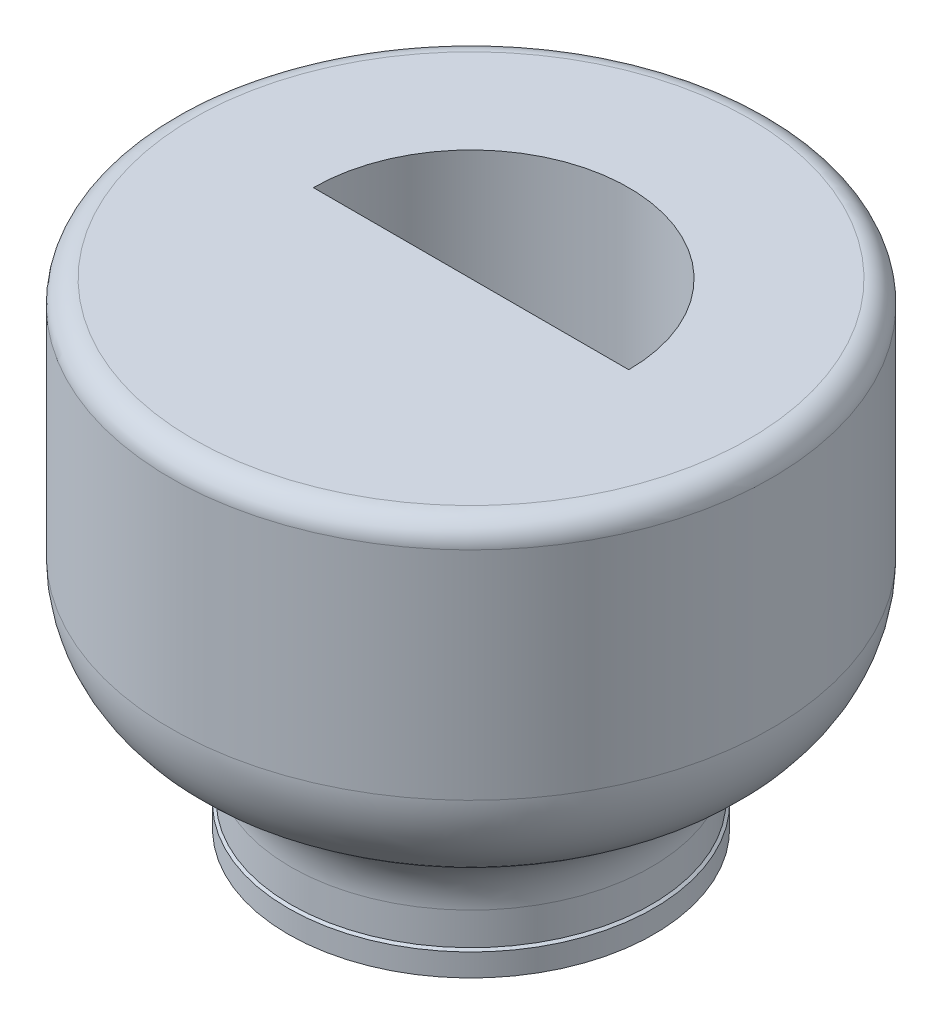
ISO-10303-21;
HEADER;
FILE_DESCRIPTION(('STEP AP214'),'2;1');
FILE_NAME('part.step','',(''),(''),'','','');
FILE_SCHEMA(('AUTOMOTIVE_DESIGN { 1 0 10303 214 1 1 1 1 }'));
ENDSEC;
DATA;
#1=APPLICATION_CONTEXT('core data for automotive mechanical design processes');
#2=APPLICATION_PROTOCOL_DEFINITION('international standard','automotive_design',2000,#1);
#3=PRODUCT_CONTEXT('',#1,'mechanical');
#4=PRODUCT('Part','Part','',(#3));
#5=PRODUCT_RELATED_PRODUCT_CATEGORY('part','',(#4));
#6=PRODUCT_DEFINITION_FORMATION('','',#4);
#7=PRODUCT_DEFINITION_CONTEXT('part definition',#1,'design');
#8=PRODUCT_DEFINITION('design','',#6,#7);
#9=PRODUCT_DEFINITION_SHAPE('','',#8);
#10=(LENGTH_UNIT() NAMED_UNIT(*) SI_UNIT(.MILLI.,.METRE.));
#11=(NAMED_UNIT(*) PLANE_ANGLE_UNIT() SI_UNIT($,.RADIAN.));
#12=(NAMED_UNIT(*) SI_UNIT($,.STERADIAN.) SOLID_ANGLE_UNIT());
#13=UNCERTAINTY_MEASURE_WITH_UNIT(LENGTH_MEASURE(1.E-05),#10,'distance_accuracy_value','');
#14=(GEOMETRIC_REPRESENTATION_CONTEXT(3) GLOBAL_UNCERTAINTY_ASSIGNED_CONTEXT((#13)) GLOBAL_UNIT_ASSIGNED_CONTEXT((#10,
#11,#12)) REPRESENTATION_CONTEXT('',''));
#15=CARTESIAN_POINT('',(0.,0.,0.));
#16=DIRECTION('',(0.,0.,1.));
#17=DIRECTION('',(1.,0.,0.));
#18=AXIS2_PLACEMENT_3D('',#15,#16,#17);
#19=CARTESIAN_POINT('',(0.,0.,0.));
#20=DIRECTION('',(0.,-1.,0.));
#21=DIRECTION('',(0.,0.,-1.));
#22=AXIS2_PLACEMENT_3D('',#19,#20,#21);
#23=CYLINDRICAL_SURFACE('',#22,22.5);
#24=CARTESIAN_POINT('',(0.,0.,0.));
#25=DIRECTION('',(0.,-1.,0.));
#26=DIRECTION('',(0.,0.,-1.));
#27=AXIS2_PLACEMENT_3D('',#24,#25,#26);
#28=CIRCLE('',#27,22.5);
#29=CARTESIAN_POINT('',(0.,0.,-22.5));
#30=VERTEX_POINT('',#29);
#31=EDGE_CURVE('E130',#30,#30,#28,.T.);
#32=ORIENTED_EDGE('',*,*,#31,.T.);
#33=EDGE_LOOP('',(#32));
#34=FACE_BOUND('',#33,.T.);
#35=CARTESIAN_POINT('',(0.,12.5,0.));
#36=DIRECTION('',(0.,-1.,0.));
#37=DIRECTION('',(0.,0.,-1.));
#38=AXIS2_PLACEMENT_3D('',#35,#36,#37);
#39=CIRCLE('',#38,22.5);
#40=CARTESIAN_POINT('',(0.,12.5,-22.5));
#41=VERTEX_POINT('',#40);
#42=EDGE_CURVE('E176',#41,#41,#39,.T.);
#43=ORIENTED_EDGE('',*,*,#42,.F.);
#44=EDGE_LOOP('',(#43));
#45=FACE_BOUND('',#44,.T.);
#46=ADVANCED_FACE('F42',(#34,#45),#23,.F.);
#47=CARTESIAN_POINT('',(0.,12.5,0.));
#48=DIRECTION('',(0.,-1.,0.));
#49=DIRECTION('',(0.,0.,-1.));
#50=AXIS2_PLACEMENT_3D('',#47,#48,#49);
#51=TOROIDAL_SURFACE('',#50,22.,0.5);
#52=ORIENTED_EDGE('',*,*,#42,.T.);
#53=EDGE_LOOP('',(#52));
#54=FACE_BOUND('',#53,.T.);
#55=CARTESIAN_POINT('',(0.,13.,0.));
#56=DIRECTION('',(0.,-1.,0.));
#57=DIRECTION('',(0.,0.,-1.));
#58=AXIS2_PLACEMENT_3D('',#55,#56,#57);
#59=CIRCLE('',#58,22.);
#60=CARTESIAN_POINT('',(0.,13.,-22.));
#61=VERTEX_POINT('',#60);
#62=EDGE_CURVE('E172',#61,#61,#59,.T.);
#63=ORIENTED_EDGE('',*,*,#62,.F.);
#64=EDGE_LOOP('',(#63));
#65=FACE_BOUND('',#64,.T.);
#66=ADVANCED_FACE('F249',(#54,#65),#51,.F.);
#67=CARTESIAN_POINT('',(0.,13.,0.));
#68=DIRECTION('',(0.,-1.,0.));
#69=DIRECTION('',(0.,0.,-1.));
#70=AXIS2_PLACEMENT_3D('',#67,#68,#69);
#71=PLANE('',#70);
#72=CARTESIAN_POINT('',(0.,13.,0.));
#73=DIRECTION('',(0.,-1.,0.));
#74=DIRECTION('',(0.,0.,1.));
#75=AXIS2_PLACEMENT_3D('',#72,#73,#74);
#76=CIRCLE('',#75,21.);
#77=CARTESIAN_POINT('',(-21.,13.,0.));
#78=VERTEX_POINT('',#77);
#79=CARTESIAN_POINT('',(21.,13.,0.));
#80=VERTEX_POINT('',#79);
#81=EDGE_CURVE('E57',#78,#80,#76,.T.);
#82=ORIENTED_EDGE('',*,*,#81,.F.);
#83=DIRECTION('',(-1.,0.,0.));
#84=VECTOR('',#83,1.);
#85=CARTESIAN_POINT('',(21.,13.,0.));
#86=LINE('',#85,#84);
#87=EDGE_CURVE('E124',#80,#78,#86,.T.);
#88=ORIENTED_EDGE('',*,*,#87,.F.);
#89=EDGE_LOOP('',(#82,#88));
#90=FACE_BOUND('',#89,.T.);
#91=ORIENTED_EDGE('',*,*,#62,.T.);
#92=EDGE_LOOP('',(#91));
#93=FACE_BOUND('',#92,.T.);
#94=ADVANCED_FACE('F190',(#90,#93),#71,.T.);
#95=CARTESIAN_POINT('',(0.,63.4278760968653,0.));
#96=DIRECTION('',(0.,1.,0.));
#97=DIRECTION('',(0.,0.,1.));
#98=AXIS2_PLACEMENT_3D('',#95,#96,#97);
#99=PLANE('',#98);
#100=CARTESIAN_POINT('',(0.,63.4278760968653,0.));
#101=DIRECTION('',(0.,1.,0.));
#102=DIRECTION('',(0.,0.,1.));
#103=AXIS2_PLACEMENT_3D('',#100,#101,#102);
#104=CIRCLE('',#103,21.);
#105=CARTESIAN_POINT('',(21.,63.4278760968653,0.));
#106=VERTEX_POINT('',#105);
#107=CARTESIAN_POINT('',(-21.,63.4278760968653,0.));
#108=VERTEX_POINT('',#107);
#109=EDGE_CURVE('E11',#106,#108,#104,.T.);
#110=ORIENTED_EDGE('',*,*,#109,.F.);
#111=DIRECTION('',(1.,0.,0.));
#112=VECTOR('',#111,1.);
#113=CARTESIAN_POINT('',(0.,63.4278760968653,0.));
#114=LINE('',#113,#112);
#115=EDGE_CURVE('E50',#108,#106,#114,.T.);
#116=ORIENTED_EDGE('',*,*,#115,.F.);
#117=EDGE_LOOP('',(#110,#116));
#118=FACE_BOUND('',#117,.T.);
#119=CARTESIAN_POINT('',(0.,63.4278760968653,0.));
#120=DIRECTION('',(0.,-1.,0.));
#121=DIRECTION('',(0.,0.,-1.));
#122=AXIS2_PLACEMENT_3D('',#119,#120,#121);
#123=CIRCLE('',#122,37.);
#124=CARTESIAN_POINT('',(0.,63.4278760968653,-37.));
#125=VERTEX_POINT('',#124);
#126=EDGE_CURVE('E168',#125,#125,#123,.T.);
#127=ORIENTED_EDGE('',*,*,#126,.F.);
#128=EDGE_LOOP('',(#127));
#129=FACE_BOUND('',#128,.T.);
#130=ADVANCED_FACE('F186',(#118,#129),#99,.T.);
#131=CARTESIAN_POINT('',(0.,60.4278760968653,0.));
#132=DIRECTION('',(0.,-1.,0.));
#133=DIRECTION('',(0.,0.,-1.));
#134=AXIS2_PLACEMENT_3D('',#131,#132,#133);
#135=TOROIDAL_SURFACE('',#134,37.,3.);
#136=ORIENTED_EDGE('',*,*,#126,.T.);
#137=EDGE_LOOP('',(#136));
#138=FACE_BOUND('',#137,.T.);
#139=CARTESIAN_POINT('',(0.,60.4278760968653,0.));
#140=DIRECTION('',(0.,-1.,0.));
#141=DIRECTION('',(0.,0.,-1.));
#142=AXIS2_PLACEMENT_3D('',#139,#140,#141);
#143=CIRCLE('',#142,40.);
#144=CARTESIAN_POINT('',(0.,60.4278760968653,-40.));
#145=VERTEX_POINT('',#144);
#146=EDGE_CURVE('E164',#145,#145,#143,.T.);
#147=ORIENTED_EDGE('',*,*,#146,.F.);
#148=EDGE_LOOP('',(#147));
#149=FACE_BOUND('',#148,.T.);
#150=ADVANCED_FACE('F189',(#138,#149),#135,.T.);
#151=CARTESIAN_POINT('',(0.,0.,0.));
#152=DIRECTION('',(0.,-1.,0.));
#153=DIRECTION('',(0.,0.,-1.));
#154=AXIS2_PLACEMENT_3D('',#151,#152,#153);
#155=CYLINDRICAL_SURFACE('',#154,40.);
#156=ORIENTED_EDGE('',*,*,#146,.T.);
#157=EDGE_LOOP('',(#156));
#158=FACE_BOUND('',#157,.T.);
#159=CARTESIAN_POINT('',(0.,31.5562889655761,0.));
#160=DIRECTION('',(0.,-1.,0.));
#161=DIRECTION('',(0.,0.,-1.));
#162=AXIS2_PLACEMENT_3D('',#159,#160,#161);
#163=CIRCLE('',#162,40.);
#164=CARTESIAN_POINT('',(0.,31.5562889655761,-40.));
#165=VERTEX_POINT('',#164);
#166=EDGE_CURVE('E160',#165,#165,#163,.T.);
#167=ORIENTED_EDGE('',*,*,#166,.F.);
#168=EDGE_LOOP('',(#167));
#169=FACE_BOUND('',#168,.T.);
#170=ADVANCED_FACE('F196',(#158,#169),#155,.T.);
#171=CARTESIAN_POINT('',(0.,31.5562889655761,0.));
#172=DIRECTION('',(0.,-1.,0.));
#173=DIRECTION('',(0.,0.,-1.));
#174=AXIS2_PLACEMENT_3D('',#171,#172,#173);
#175=TOROIDAL_SURFACE('',#174,25.,15.);
#176=ORIENTED_EDGE('',*,*,#166,.T.);
#177=EDGE_LOOP('',(#176));
#178=FACE_BOUND('',#177,.T.);
#179=CARTESIAN_POINT('',(0.,18.9896485668923,0.));
#180=DIRECTION('',(0.,-1.,0.));
#181=DIRECTION('',(0.,0.,-1.));
#182=AXIS2_PLACEMENT_3D('',#179,#180,#181);
#183=CIRCLE('',#182,33.1902105644586);
#184=CARTESIAN_POINT('',(0.,18.9896485668923,-33.1902105644586));
#185=VERTEX_POINT('',#184);
#186=EDGE_CURVE('E156',#185,#185,#183,.T.);
#187=ORIENTED_EDGE('',*,*,#186,.F.);
#188=EDGE_LOOP('',(#187));
#189=FACE_BOUND('',#188,.T.);
#190=ADVANCED_FACE('F202',(#178,#189),#175,.T.);
#191=CARTESIAN_POINT('',(0.,15.9588183533154,0.));
#192=DIRECTION('',(0.,1.,0.));
#193=DIRECTION('',(0.,0.,1.));
#194=AXIS2_PLACEMENT_3D('',#191,#192,#193);
#195=CONICAL_SURFACE('',#194,28.5398596236943,0.993197296529964);
#196=ORIENTED_EDGE('',*,*,#186,.T.);
#197=EDGE_LOOP('',(#196));
#198=FACE_BOUND('',#197,.T.);
#199=CARTESIAN_POINT('',(0.,15.9588183533154,0.));
#200=DIRECTION('',(0.,-1.,0.));
#201=DIRECTION('',(0.,0.,-1.));
#202=AXIS2_PLACEMENT_3D('',#199,#200,#201);
#203=CIRCLE('',#202,28.5398596236943);
#204=CARTESIAN_POINT('',(0.,15.9588183533154,-28.5398596236943));
#205=VERTEX_POINT('',#204);
#206=EDGE_CURVE('E152',#205,#205,#203,.T.);
#207=ORIENTED_EDGE('',*,*,#206,.F.);
#208=EDGE_LOOP('',(#207));
#209=FACE_BOUND('',#208,.T.);
#210=ADVANCED_FACE('F208',(#198,#209),#195,.T.);
#211=CARTESIAN_POINT('',(0.,7.58105808752617,0.));
#212=DIRECTION('',(0.,-1.,0.));
#213=DIRECTION('',(0.,0.,-1.));
#214=AXIS2_PLACEMENT_3D('',#211,#212,#213);
#215=TOROIDAL_SURFACE('',#214,34.,10.);
#216=ORIENTED_EDGE('',*,*,#206,.T.);
#217=EDGE_LOOP('',(#216));
#218=FACE_BOUND('',#217,.T.);
#219=CARTESIAN_POINT('',(0.,7.58105808752612,0.));
#220=DIRECTION('',(0.,-1.,0.));
#221=DIRECTION('',(0.,0.,-1.));
#222=AXIS2_PLACEMENT_3D('',#219,#220,#221);
#223=CIRCLE('',#222,24.);
#224=CARTESIAN_POINT('',(0.,7.58105808752612,-24.));
#225=VERTEX_POINT('',#224);
#226=EDGE_CURVE('E148',#225,#225,#223,.T.);
#227=ORIENTED_EDGE('',*,*,#226,.F.);
#228=EDGE_LOOP('',(#227));
#229=FACE_BOUND('',#228,.T.);
#230=ADVANCED_FACE('F214',(#218,#229),#215,.F.);
#231=CARTESIAN_POINT('',(0.,0.,0.));
#232=DIRECTION('',(0.,-1.,0.));
#233=DIRECTION('',(0.,0.,-1.));
#234=AXIS2_PLACEMENT_3D('',#231,#232,#233);
#235=CYLINDRICAL_SURFACE('',#234,24.);
#236=ORIENTED_EDGE('',*,*,#226,.T.);
#237=EDGE_LOOP('',(#236));
#238=FACE_BOUND('',#237,.T.);
#239=CARTESIAN_POINT('',(0.,3.25,0.));
#240=DIRECTION('',(0.,-1.,0.));
#241=DIRECTION('',(0.,0.,-1.));
#242=AXIS2_PLACEMENT_3D('',#239,#240,#241);
#243=CIRCLE('',#242,24.);
#244=CARTESIAN_POINT('',(0.,3.25,-24.));
#245=VERTEX_POINT('',#244);
#246=EDGE_CURVE('E144',#245,#245,#243,.T.);
#247=ORIENTED_EDGE('',*,*,#246,.F.);
#248=EDGE_LOOP('',(#247));
#249=FACE_BOUND('',#248,.T.);
#250=ADVANCED_FACE('F220',(#238,#249),#235,.T.);
#251=CARTESIAN_POINT('',(0.,3.,0.));
#252=DIRECTION('',(0.,-1.,0.));
#253=DIRECTION('',(0.,0.,-1.));
#254=AXIS2_PLACEMENT_3D('',#251,#252,#253);
#255=CONICAL_SURFACE('',#254,24.35,0.950546840812071);
#256=ORIENTED_EDGE('',*,*,#246,.T.);
#257=EDGE_LOOP('',(#256));
#258=FACE_BOUND('',#257,.T.);
#259=CARTESIAN_POINT('',(0.,3.,0.));
#260=DIRECTION('',(0.,-1.,0.));
#261=DIRECTION('',(0.,0.,-1.));
#262=AXIS2_PLACEMENT_3D('',#259,#260,#261);
#263=CIRCLE('',#262,24.35);
#264=CARTESIAN_POINT('',(0.,3.,-24.35));
#265=VERTEX_POINT('',#264);
#266=EDGE_CURVE('E140',#265,#265,#263,.T.);
#267=ORIENTED_EDGE('',*,*,#266,.F.);
#268=EDGE_LOOP('',(#267));
#269=FACE_BOUND('',#268,.T.);
#270=ADVANCED_FACE('F226',(#258,#269),#255,.T.);
#271=CARTESIAN_POINT('',(0.,0.,0.));
#272=DIRECTION('',(0.,-1.,0.));
#273=DIRECTION('',(0.,0.,-1.));
#274=AXIS2_PLACEMENT_3D('',#271,#272,#273);
#275=CYLINDRICAL_SURFACE('',#274,24.35);
#276=ORIENTED_EDGE('',*,*,#266,.T.);
#277=EDGE_LOOP('',(#276));
#278=FACE_BOUND('',#277,.T.);
#279=CARTESIAN_POINT('',(0.,0.,0.));
#280=DIRECTION('',(0.,-1.,0.));
#281=DIRECTION('',(0.,0.,-1.));
#282=AXIS2_PLACEMENT_3D('',#279,#280,#281);
#283=CIRCLE('',#282,24.35);
#284=CARTESIAN_POINT('',(0.,0.,-24.35));
#285=VERTEX_POINT('',#284);
#286=EDGE_CURVE('E136',#285,#285,#283,.T.);
#287=ORIENTED_EDGE('',*,*,#286,.F.);
#288=EDGE_LOOP('',(#287));
#289=FACE_BOUND('',#288,.T.);
#290=ADVANCED_FACE('F232',(#278,#289),#275,.T.);
#291=CARTESIAN_POINT('',(22.5,0.,0.));
#292=DIRECTION('',(0.,-1.,0.));
#293=DIRECTION('',(0.,0.,-1.));
#294=AXIS2_PLACEMENT_3D('',#291,#292,#293);
#295=PLANE('',#294);
#296=ORIENTED_EDGE('',*,*,#286,.T.);
#297=EDGE_LOOP('',(#296));
#298=FACE_BOUND('',#297,.T.);
#299=ORIENTED_EDGE('',*,*,#31,.F.);
#300=EDGE_LOOP('',(#299));
#301=FACE_BOUND('',#300,.T.);
#302=ADVANCED_FACE('F238',(#298,#301),#295,.T.);
#303=CARTESIAN_POINT('',(0.,73.,0.));
#304=DIRECTION('',(0.,-1.,0.));
#305=DIRECTION('',(0.,0.,-1.));
#306=AXIS2_PLACEMENT_3D('',#303,#304,#305);
#307=CYLINDRICAL_SURFACE('',#306,21.);
#308=ORIENTED_EDGE('',*,*,#109,.T.);
#309=DIRECTION('',(0.,-1.,0.));
#310=VECTOR('',#309,1.);
#311=CARTESIAN_POINT('',(-21.,73.,0.));
#312=LINE('',#311,#310);
#313=EDGE_CURVE('E64',#108,#78,#312,.T.);
#314=ORIENTED_EDGE('',*,*,#313,.T.);
#315=ORIENTED_EDGE('',*,*,#81,.T.);
#316=DIRECTION('',(0.,-1.,0.));
#317=VECTOR('',#316,1.);
#318=CARTESIAN_POINT('',(21.,73.,0.));
#319=LINE('',#318,#317);
#320=EDGE_CURVE('E127',#106,#80,#319,.T.);
#321=ORIENTED_EDGE('',*,*,#320,.F.);
#322=EDGE_LOOP('',(#308,#314,#315,#321));
#323=FACE_BOUND('',#322,.T.);
#324=ADVANCED_FACE('F185',(#323),#307,.F.);
#325=CARTESIAN_POINT('',(21.,73.,0.));
#326=DIRECTION('',(0.,0.,1.));
#327=DIRECTION('',(1.,0.,0.));
#328=AXIS2_PLACEMENT_3D('',#325,#326,#327);
#329=PLANE('',#328);
#330=ORIENTED_EDGE('',*,*,#115,.T.);
#331=ORIENTED_EDGE('',*,*,#320,.T.);
#332=ORIENTED_EDGE('',*,*,#87,.T.);
#333=ORIENTED_EDGE('',*,*,#313,.F.);
#334=EDGE_LOOP('',(#330,#331,#332,#333));
#335=FACE_BOUND('',#334,.T.);
#336=ADVANCED_FACE('F181',(#335),#329,.F.);
#337=CLOSED_SHELL('',(#46,#66,#94,#130,#150,#170,#190,#210,#230,#250,#270,#290,#302,#324,#336));
#338=CARTESIAN_POINT('',(0.0221290186607753,62.4278760968653,-0.0548714029169534));
#339=DIRECTION('',(0.,-1.,0.));
#340=DIRECTION('',(0.,0.,-1.));
#341=AXIS2_PLACEMENT_3D('',#338,#339,#340);
#342=PLANE('',#341);
#343=CARTESIAN_POINT('',(0.0221290186607753,62.4278760968653,-0.0548714029169534));
#344=DIRECTION('',(0.,1.,0.));
#345=DIRECTION('',(0.,0.,-1.));
#346=AXIS2_PLACEMENT_3D('',#343,#344,#345);
#347=CIRCLE('',#346,37.0591655670552);
#348=CARTESIAN_POINT('',(0.0221290186607753,62.4278760968653,-37.1140369699721));
#349=VERTEX_POINT('',#348);
#350=EDGE_CURVE('E94',#349,#349,#347,.T.);
#351=ORIENTED_EDGE('',*,*,#350,.F.);
#352=EDGE_LOOP('',(#351));
#353=FACE_BOUND('',#352,.T.);
#354=CARTESIAN_POINT('',(0.0430737136390516,62.4278760968653,-1.99976807517553));
#355=DIRECTION('',(0.,1.,0.));
#356=DIRECTION('',(0.,0.,-1.));
#357=AXIS2_PLACEMENT_3D('',#354,#355,#356);
#358=CIRCLE('',#357,22.3619348601426);
#359=CARTESIAN_POINT('',(22.,62.4278760968653,2.2369191618735));
#360=VERTEX_POINT('',#359);
#361=CARTESIAN_POINT('',(-22.,62.4278760968653,1.76308083812649));
#362=VERTEX_POINT('',#361);
#363=EDGE_CURVE('E112',#360,#362,#358,.T.);
#364=ORIENTED_EDGE('',*,*,#363,.T.);
#365=DIRECTION('',(0.999942018793882,0.,0.0107684284097612));
#366=VECTOR('',#365,1.);
#367=CARTESIAN_POINT('',(-22.,62.4278760968653,1.76308083812649));
#368=LINE('',#367,#366);
#369=EDGE_CURVE('E88',#362,#360,#368,.T.);
#370=ORIENTED_EDGE('',*,*,#369,.T.);
#371=EDGE_LOOP('',(#364,#370));
#372=FACE_BOUND('',#371,.T.);
#373=ADVANCED_FACE('F269',(#353,#372),#342,.T.);
#374=CARTESIAN_POINT('',(0.0221290186607757,62.4278760968653,-0.0548714029169534));
#375=DIRECTION('',(0.,-1.,0.));
#376=DIRECTION('',(0.,0.,-1.));
#377=AXIS2_PLACEMENT_3D('',#374,#375,#376);
#378=CYLINDRICAL_SURFACE('',#377,37.0591655670552);
#379=ORIENTED_EDGE('',*,*,#350,.T.);
#380=EDGE_LOOP('',(#379));
#381=FACE_BOUND('',#380,.T.);
#382=CARTESIAN_POINT('',(0.0221290186607753,45.4278760968653,-0.0548714029169534));
#383=DIRECTION('',(0.,1.,0.));
#384=DIRECTION('',(0.,0.,-1.));
#385=AXIS2_PLACEMENT_3D('',#382,#383,#384);
#386=CIRCLE('',#385,37.0591655670552);
#387=CARTESIAN_POINT('',(0.0221290186607753,45.4278760968653,-37.1140369699721));
#388=VERTEX_POINT('',#387);
#389=EDGE_CURVE('E103',#388,#388,#386,.T.);
#390=ORIENTED_EDGE('',*,*,#389,.F.);
#391=EDGE_LOOP('',(#390));
#392=FACE_BOUND('',#391,.T.);
#393=ADVANCED_FACE('F266',(#381,#392),#378,.F.);
#394=CARTESIAN_POINT('',(0.0430737136390516,62.4278760968653,-1.99976807517553));
#395=DIRECTION('',(0.,-1.,0.));
#396=DIRECTION('',(0.,0.,-1.));
#397=AXIS2_PLACEMENT_3D('',#394,#395,#396);
#398=CYLINDRICAL_SURFACE('',#397,22.3619348601426);
#399=DIRECTION('',(0.,-1.,0.));
#400=VECTOR('',#399,1.);
#401=CARTESIAN_POINT('',(-22.,62.4278760968653,1.76308083812649));
#402=LINE('',#401,#400);
#403=CARTESIAN_POINT('',(-22.,45.4278760968653,1.76308083812649));
#404=VERTEX_POINT('',#403);
#405=EDGE_CURVE('E83',#362,#404,#402,.T.);
#406=ORIENTED_EDGE('',*,*,#405,.F.);
#407=ORIENTED_EDGE('',*,*,#363,.F.);
#408=DIRECTION('',(0.,-1.,0.));
#409=VECTOR('',#408,1.);
#410=CARTESIAN_POINT('',(22.,62.4278760968653,2.2369191618735));
#411=LINE('',#410,#409);
#412=CARTESIAN_POINT('',(22.,45.4278760968653,2.2369191618735));
#413=VERTEX_POINT('',#412);
#414=EDGE_CURVE('E95',#360,#413,#411,.T.);
#415=ORIENTED_EDGE('',*,*,#414,.T.);
#416=CARTESIAN_POINT('',(0.0430737136390516,45.4278760968653,-1.99976807517553));
#417=DIRECTION('',(0.,1.,0.));
#418=DIRECTION('',(0.,0.,-1.));
#419=AXIS2_PLACEMENT_3D('',#416,#417,#418);
#420=CIRCLE('',#419,22.3619348601426);
#421=EDGE_CURVE('E101',#413,#404,#420,.T.);
#422=ORIENTED_EDGE('',*,*,#421,.T.);
#423=EDGE_LOOP('',(#406,#407,#415,#422));
#424=FACE_BOUND('',#423,.T.);
#425=ADVANCED_FACE('F105',(#424),#398,.T.);
#426=CARTESIAN_POINT('',(-22.,62.4278760968653,1.76308083812649));
#427=DIRECTION('',(0.0107684284097612,0.,-0.999942018793882));
#428=DIRECTION('',(-0.999942018793882,0.,-0.0107684284097612));
#429=AXIS2_PLACEMENT_3D('',#426,#427,#428);
#430=PLANE('',#429);
#431=ORIENTED_EDGE('',*,*,#414,.F.);
#432=ORIENTED_EDGE('',*,*,#369,.F.);
#433=ORIENTED_EDGE('',*,*,#405,.T.);
#434=DIRECTION('',(0.999942018793882,0.,0.0107684284097612));
#435=VECTOR('',#434,1.);
#436=CARTESIAN_POINT('',(-22.,45.4278760968653,1.76308083812649));
#437=LINE('',#436,#435);
#438=EDGE_CURVE('E87',#404,#413,#437,.T.);
#439=ORIENTED_EDGE('',*,*,#438,.T.);
#440=EDGE_LOOP('',(#431,#432,#433,#439));
#441=FACE_BOUND('',#440,.T.);
#442=ADVANCED_FACE('F86',(#441),#430,.F.);
#443=CARTESIAN_POINT('',(0.0221290186607753,45.4278760968653,-0.0548714029169534));
#444=DIRECTION('',(0.,-1.,0.));
#445=DIRECTION('',(0.,0.,-1.));
#446=AXIS2_PLACEMENT_3D('',#443,#444,#445);
#447=PLANE('',#446);
#448=ORIENTED_EDGE('',*,*,#421,.F.);
#449=ORIENTED_EDGE('',*,*,#438,.F.);
#450=EDGE_LOOP('',(#448,#449));
#451=FACE_BOUND('',#450,.T.);
#452=ORIENTED_EDGE('',*,*,#389,.T.);
#453=EDGE_LOOP('',(#452));
#454=FACE_BOUND('',#453,.T.);
#455=ADVANCED_FACE('F99',(#451,#454),#447,.F.);
#456=CLOSED_SHELL('',(#373,#393,#425,#442,#455));
#457=ORIENTED_CLOSED_SHELL('',*,#456,.T.);
#458=BREP_WITH_VOIDS('B2',#337,(#457));
#459=ADVANCED_BREP_SHAPE_REPRESENTATION('',(#18,#458),#14);
#460=SHAPE_DEFINITION_REPRESENTATION(#9,#459);
ENDSEC;
END-ISO-10303-21;
